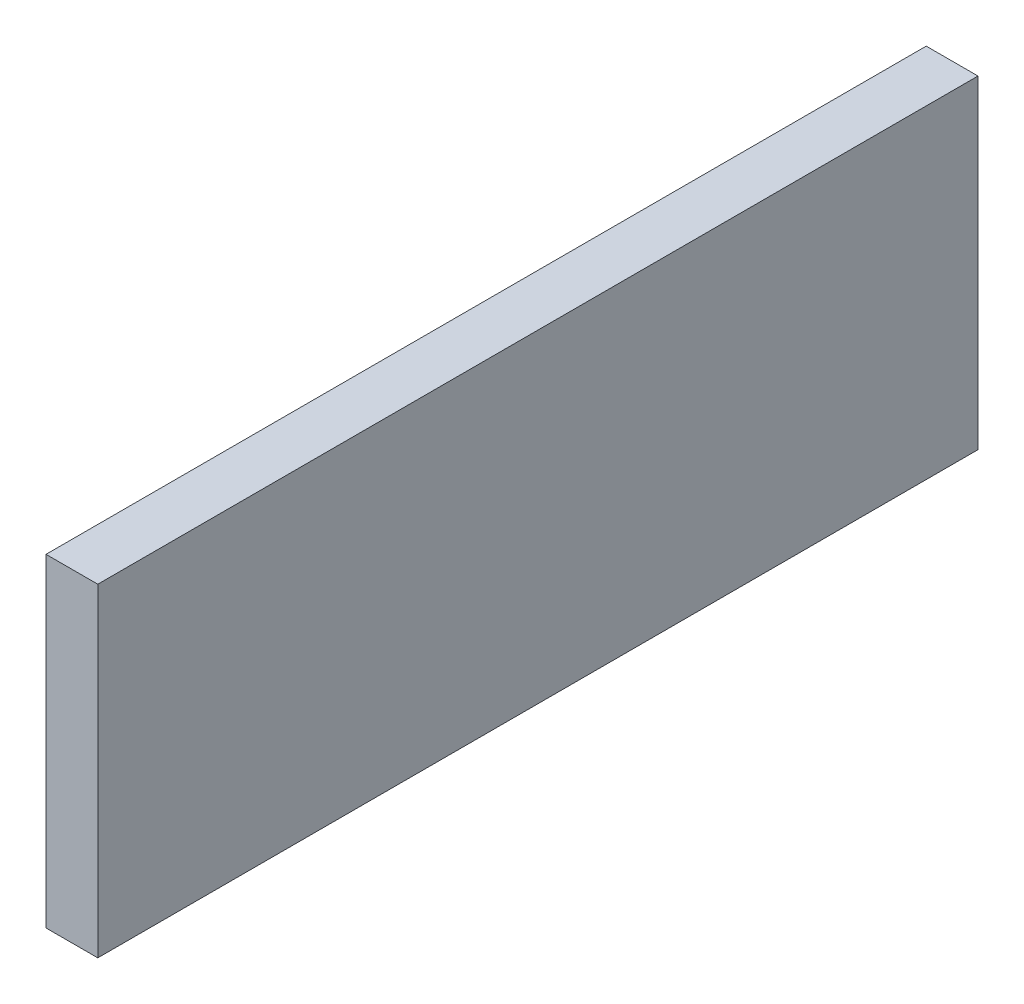
ISO-10303-21;
HEADER;
FILE_DESCRIPTION(('STEP AP214'),'2;1');
FILE_NAME('part.step','',(''),(''),'','','');
FILE_SCHEMA(('AUTOMOTIVE_DESIGN { 1 0 10303 214 1 1 1 1 }'));
ENDSEC;
DATA;
#1=APPLICATION_CONTEXT('core data for automotive mechanical design processes');
#2=APPLICATION_PROTOCOL_DEFINITION('international standard','automotive_design',2000,#1);
#3=PRODUCT_CONTEXT('',#1,'mechanical');
#4=PRODUCT('Part','Part','',(#3));
#5=PRODUCT_RELATED_PRODUCT_CATEGORY('part','',(#4));
#6=PRODUCT_DEFINITION_FORMATION('','',#4);
#7=PRODUCT_DEFINITION_CONTEXT('part definition',#1,'design');
#8=PRODUCT_DEFINITION('design','',#6,#7);
#9=PRODUCT_DEFINITION_SHAPE('','',#8);
#10=(LENGTH_UNIT() NAMED_UNIT(*) SI_UNIT(.MILLI.,.METRE.));
#11=(NAMED_UNIT(*) PLANE_ANGLE_UNIT() SI_UNIT($,.RADIAN.));
#12=(NAMED_UNIT(*) SI_UNIT($,.STERADIAN.) SOLID_ANGLE_UNIT());
#13=UNCERTAINTY_MEASURE_WITH_UNIT(LENGTH_MEASURE(1.E-05),#10,'distance_accuracy_value','');
#14=(GEOMETRIC_REPRESENTATION_CONTEXT(3) GLOBAL_UNCERTAINTY_ASSIGNED_CONTEXT((#13)) GLOBAL_UNIT_ASSIGNED_CONTEXT((#10,
#11,#12)) REPRESENTATION_CONTEXT('',''));
#15=CARTESIAN_POINT('',(0.,0.,0.));
#16=DIRECTION('',(0.,0.,1.));
#17=DIRECTION('',(1.,0.,0.));
#18=AXIS2_PLACEMENT_3D('',#15,#16,#17);
#19=CARTESIAN_POINT('',(4.,12.0121951219512,26.4878048780488));
#20=DIRECTION('',(0.,0.,-1.));
#21=DIRECTION('',(-1.,0.,0.));
#22=AXIS2_PLACEMENT_3D('',#19,#20,#21);
#23=PLANE('',#22);
#24=DIRECTION('',(0.,-1.,0.));
#25=VECTOR('',#24,1.);
#26=CARTESIAN_POINT('',(0.,12.0121951219512,26.4878048780488));
#27=LINE('',#26,#25);
#28=CARTESIAN_POINT('',(0.,12.0121951219512,26.4878048780488));
#29=VERTEX_POINT('',#28);
#30=CARTESIAN_POINT('',(0.,-12.9878048780488,26.4878048780488));
#31=VERTEX_POINT('',#30);
#32=EDGE_CURVE('E96',#29,#31,#27,.T.);
#33=ORIENTED_EDGE('',*,*,#32,.T.);
#34=DIRECTION('',(-1.,0.,0.));
#35=VECTOR('',#34,1.);
#36=CARTESIAN_POINT('',(4.,-12.9878048780488,26.4878048780488));
#37=LINE('',#36,#35);
#38=CARTESIAN_POINT('',(4.,-12.9878048780488,26.4878048780488));
#39=VERTEX_POINT('',#38);
#40=EDGE_CURVE('E11',#39,#31,#37,.T.);
#41=ORIENTED_EDGE('',*,*,#40,.F.);
#42=DIRECTION('',(0.,-1.,0.));
#43=VECTOR('',#42,1.);
#44=CARTESIAN_POINT('',(4.,12.0121951219512,26.4878048780488));
#45=LINE('',#44,#43);
#46=CARTESIAN_POINT('',(4.,12.0121951219512,26.4878048780488));
#47=VERTEX_POINT('',#46);
#48=EDGE_CURVE('E84',#47,#39,#45,.T.);
#49=ORIENTED_EDGE('',*,*,#48,.F.);
#50=DIRECTION('',(-1.,0.,0.));
#51=VECTOR('',#50,1.);
#52=CARTESIAN_POINT('',(4.,12.0121951219512,26.4878048780488));
#53=LINE('',#52,#51);
#54=EDGE_CURVE('E92',#47,#29,#53,.T.);
#55=ORIENTED_EDGE('',*,*,#54,.T.);
#56=EDGE_LOOP('',(#33,#41,#49,#55));
#57=FACE_BOUND('',#56,.T.);
#58=ADVANCED_FACE('F33',(#57),#23,.F.);
#59=CARTESIAN_POINT('',(4.,-12.9878048780488,26.4878048780488));
#60=DIRECTION('',(0.,1.,0.));
#61=DIRECTION('',(0.,0.,1.));
#62=AXIS2_PLACEMENT_3D('',#59,#60,#61);
#63=PLANE('',#62);
#64=DIRECTION('',(0.,0.,-1.));
#65=VECTOR('',#64,1.);
#66=CARTESIAN_POINT('',(0.,-12.9878048780488,26.4878048780488));
#67=LINE('',#66,#65);
#68=CARTESIAN_POINT('',(0.,-12.9878048780488,-41.5121951219512));
#69=VERTEX_POINT('',#68);
#70=EDGE_CURVE('E88',#31,#69,#67,.T.);
#71=ORIENTED_EDGE('',*,*,#70,.T.);
#72=DIRECTION('',(-1.,0.,0.));
#73=VECTOR('',#72,1.);
#74=CARTESIAN_POINT('',(4.,-12.9878048780488,-41.5121951219512));
#75=LINE('',#74,#73);
#76=CARTESIAN_POINT('',(4.,-12.9878048780488,-41.5121951219512));
#77=VERTEX_POINT('',#76);
#78=EDGE_CURVE('E41',#77,#69,#75,.T.);
#79=ORIENTED_EDGE('',*,*,#78,.F.);
#80=DIRECTION('',(0.,0.,-1.));
#81=VECTOR('',#80,1.);
#82=CARTESIAN_POINT('',(4.,-12.9878048780488,26.4878048780488));
#83=LINE('',#82,#81);
#84=EDGE_CURVE('E79',#39,#77,#83,.T.);
#85=ORIENTED_EDGE('',*,*,#84,.F.);
#86=ORIENTED_EDGE('',*,*,#40,.T.);
#87=EDGE_LOOP('',(#71,#79,#85,#86));
#88=FACE_BOUND('',#87,.T.);
#89=ADVANCED_FACE('F87',(#88),#63,.F.);
#90=CARTESIAN_POINT('',(4.,12.0121951219512,-41.5121951219512));
#91=DIRECTION('',(0.,0.,1.));
#92=DIRECTION('',(1.,0.,0.));
#93=AXIS2_PLACEMENT_3D('',#90,#91,#92);
#94=PLANE('',#93);
#95=DIRECTION('',(0.,1.,0.));
#96=VECTOR('',#95,1.);
#97=CARTESIAN_POINT('',(0.,12.0121951219512,-41.5121951219512));
#98=LINE('',#97,#96);
#99=CARTESIAN_POINT('',(0.,12.0121951219512,-41.5121951219512));
#100=VERTEX_POINT('',#99);
#101=EDGE_CURVE('E66',#69,#100,#98,.T.);
#102=ORIENTED_EDGE('',*,*,#101,.T.);
#103=DIRECTION('',(-1.,0.,0.));
#104=VECTOR('',#103,1.);
#105=CARTESIAN_POINT('',(4.,12.0121951219512,-41.5121951219512));
#106=LINE('',#105,#104);
#107=CARTESIAN_POINT('',(4.,12.0121951219512,-41.5121951219512));
#108=VERTEX_POINT('',#107);
#109=EDGE_CURVE('E89',#108,#100,#106,.T.);
#110=ORIENTED_EDGE('',*,*,#109,.F.);
#111=DIRECTION('',(0.,1.,0.));
#112=VECTOR('',#111,1.);
#113=CARTESIAN_POINT('',(4.,12.0121951219512,-41.5121951219512));
#114=LINE('',#113,#112);
#115=EDGE_CURVE('E82',#77,#108,#114,.T.);
#116=ORIENTED_EDGE('',*,*,#115,.F.);
#117=ORIENTED_EDGE('',*,*,#78,.T.);
#118=EDGE_LOOP('',(#102,#110,#116,#117));
#119=FACE_BOUND('',#118,.T.);
#120=ADVANCED_FACE('F90',(#119),#94,.F.);
#121=CARTESIAN_POINT('',(4.,12.0121951219512,26.4878048780488));
#122=DIRECTION('',(0.,-1.,0.));
#123=DIRECTION('',(0.,0.,-1.));
#124=AXIS2_PLACEMENT_3D('',#121,#122,#123);
#125=PLANE('',#124);
#126=DIRECTION('',(0.,0.,1.));
#127=VECTOR('',#126,1.);
#128=CARTESIAN_POINT('',(0.,12.0121951219512,26.4878048780488));
#129=LINE('',#128,#127);
#130=EDGE_CURVE('E72',#100,#29,#129,.T.);
#131=ORIENTED_EDGE('',*,*,#130,.T.);
#132=ORIENTED_EDGE('',*,*,#54,.F.);
#133=DIRECTION('',(0.,0.,1.));
#134=VECTOR('',#133,1.);
#135=CARTESIAN_POINT('',(4.,12.0121951219512,26.4878048780488));
#136=LINE('',#135,#134);
#137=EDGE_CURVE('E49',#108,#47,#136,.T.);
#138=ORIENTED_EDGE('',*,*,#137,.F.);
#139=ORIENTED_EDGE('',*,*,#109,.T.);
#140=EDGE_LOOP('',(#131,#132,#138,#139));
#141=FACE_BOUND('',#140,.T.);
#142=ADVANCED_FACE('F103',(#141),#125,.F.);
#143=CARTESIAN_POINT('',(4.,0.,0.));
#144=DIRECTION('',(1.,0.,0.));
#145=DIRECTION('',(0.,0.,-1.));
#146=AXIS2_PLACEMENT_3D('',#143,#144,#145);
#147=PLANE('',#146);
#148=ORIENTED_EDGE('',*,*,#48,.T.);
#149=ORIENTED_EDGE('',*,*,#84,.T.);
#150=ORIENTED_EDGE('',*,*,#115,.T.);
#151=ORIENTED_EDGE('',*,*,#137,.T.);
#152=EDGE_LOOP('',(#148,#149,#150,#151));
#153=FACE_BOUND('',#152,.T.);
#154=ADVANCED_FACE('F80',(#153),#147,.T.);
#155=CARTESIAN_POINT('',(0.,0.,0.));
#156=DIRECTION('',(1.,0.,0.));
#157=DIRECTION('',(0.,0.,-1.));
#158=AXIS2_PLACEMENT_3D('',#155,#156,#157);
#159=PLANE('',#158);
#160=ORIENTED_EDGE('',*,*,#32,.F.);
#161=ORIENTED_EDGE('',*,*,#130,.F.);
#162=ORIENTED_EDGE('',*,*,#101,.F.);
#163=ORIENTED_EDGE('',*,*,#70,.F.);
#164=EDGE_LOOP('',(#160,#161,#162,#163));
#165=FACE_BOUND('',#164,.T.);
#166=ADVANCED_FACE('F106',(#165),#159,.F.);
#167=CLOSED_SHELL('',(#58,#89,#120,#142,#154,#166));
#168=MANIFOLD_SOLID_BREP('B2',#167);
#169=ADVANCED_BREP_SHAPE_REPRESENTATION('',(#18,#168),#14);
#170=SHAPE_DEFINITION_REPRESENTATION(#9,#169);
ENDSEC;
END-ISO-10303-21;
